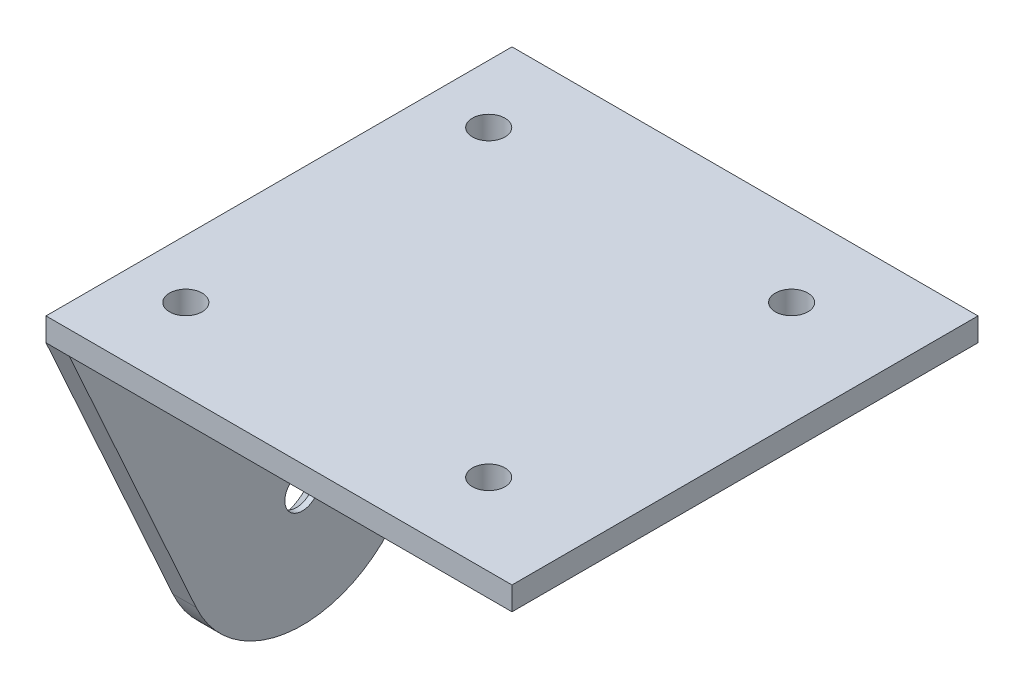
ISO-10303-21;
HEADER;
FILE_DESCRIPTION(('STEP AP214'),'2;1');
FILE_NAME('part.step','',(''),(''),'','','');
FILE_SCHEMA(('AUTOMOTIVE_DESIGN { 1 0 10303 214 1 1 1 1 }'));
ENDSEC;
DATA;
#1=APPLICATION_CONTEXT('core data for automotive mechanical design processes');
#2=APPLICATION_PROTOCOL_DEFINITION('international standard','automotive_design',2000,#1);
#3=PRODUCT_CONTEXT('',#1,'mechanical');
#4=PRODUCT('Part','Part','',(#3));
#5=PRODUCT_RELATED_PRODUCT_CATEGORY('part','',(#4));
#6=PRODUCT_DEFINITION_FORMATION('','',#4);
#7=PRODUCT_DEFINITION_CONTEXT('part definition',#1,'design');
#8=PRODUCT_DEFINITION('design','',#6,#7);
#9=PRODUCT_DEFINITION_SHAPE('','',#8);
#10=(LENGTH_UNIT() NAMED_UNIT(*) SI_UNIT(.MILLI.,.METRE.));
#11=(NAMED_UNIT(*) PLANE_ANGLE_UNIT() SI_UNIT($,.RADIAN.));
#12=(NAMED_UNIT(*) SI_UNIT($,.STERADIAN.) SOLID_ANGLE_UNIT());
#13=UNCERTAINTY_MEASURE_WITH_UNIT(LENGTH_MEASURE(1.E-05),#10,'distance_accuracy_value','');
#14=(GEOMETRIC_REPRESENTATION_CONTEXT(3) GLOBAL_UNCERTAINTY_ASSIGNED_CONTEXT((#13)) GLOBAL_UNIT_ASSIGNED_CONTEXT((#10,
#11,#12)) REPRESENTATION_CONTEXT('',''));
#15=CARTESIAN_POINT('',(0.,0.,0.));
#16=DIRECTION('',(0.,0.,1.));
#17=DIRECTION('',(1.,0.,0.));
#18=AXIS2_PLACEMENT_3D('',#15,#16,#17);
#19=CARTESIAN_POINT('',(0.,0.,0.));
#20=DIRECTION('',(0.,-1.,0.));
#21=DIRECTION('',(0.,0.,-1.));
#22=AXIS2_PLACEMENT_3D('',#19,#20,#21);
#23=PLANE('',#22);
#24=CARTESIAN_POINT('',(-4.55066353464085,0.,9.72300657900497));
#25=DIRECTION('',(0.,1.,0.));
#26=DIRECTION('',(0.,0.,1.));
#27=AXIS2_PLACEMENT_3D('',#24,#25,#26);
#28=CIRCLE('',#27,1.4);
#29=CARTESIAN_POINT('',(-4.55066353464085,0.,11.123006579005));
#30=VERTEX_POINT('',#29);
#31=EDGE_CURVE('E179',#30,#30,#28,.T.);
#32=ORIENTED_EDGE('',*,*,#31,.T.);
#33=EDGE_LOOP('',(#32));
#34=FACE_BOUND('',#33,.T.);
#35=CARTESIAN_POINT('',(21.4493364653592,0.,-16.276993420995));
#36=DIRECTION('',(0.,1.,0.));
#37=DIRECTION('',(0.,0.,1.));
#38=AXIS2_PLACEMENT_3D('',#35,#36,#37);
#39=CIRCLE('',#38,1.4);
#40=CARTESIAN_POINT('',(21.4493364653592,0.,-14.876993420995));
#41=VERTEX_POINT('',#40);
#42=EDGE_CURVE('E190',#41,#41,#39,.T.);
#43=ORIENTED_EDGE('',*,*,#42,.T.);
#44=EDGE_LOOP('',(#43));
#45=FACE_BOUND('',#44,.T.);
#46=CARTESIAN_POINT('',(-4.55066353464085,0.,-16.276993420995));
#47=DIRECTION('',(0.,1.,0.));
#48=DIRECTION('',(0.,0.,1.));
#49=AXIS2_PLACEMENT_3D('',#46,#47,#48);
#50=CIRCLE('',#49,1.4);
#51=CARTESIAN_POINT('',(-4.55066353464085,0.,-14.876993420995));
#52=VERTEX_POINT('',#51);
#53=EDGE_CURVE('E196',#52,#52,#50,.T.);
#54=ORIENTED_EDGE('',*,*,#53,.T.);
#55=EDGE_LOOP('',(#54));
#56=FACE_BOUND('',#55,.T.);
#57=CARTESIAN_POINT('',(21.4493364653592,0.,9.72300657900497));
#58=DIRECTION('',(0.,1.,0.));
#59=DIRECTION('',(0.,0.,1.));
#60=AXIS2_PLACEMENT_3D('',#57,#58,#59);
#61=CIRCLE('',#60,1.4);
#62=CARTESIAN_POINT('',(21.4493364653592,0.,11.123006579005));
#63=VERTEX_POINT('',#62);
#64=EDGE_CURVE('E184',#63,#63,#61,.T.);
#65=ORIENTED_EDGE('',*,*,#64,.T.);
#66=EDGE_LOOP('',(#65));
#67=FACE_BOUND('',#66,.T.);
#68=DIRECTION('',(1.,0.,0.));
#69=VECTOR('',#68,1.);
#70=CARTESIAN_POINT('',(-9.55066353464085,0.,16.723006579005));
#71=LINE('',#70,#69);
#72=CARTESIAN_POINT('',(-7.55066353464085,0.,16.723006579005));
#73=VERTEX_POINT('',#72);
#74=CARTESIAN_POINT('',(30.4493364653592,0.,16.723006579005));
#75=VERTEX_POINT('',#74);
#76=EDGE_CURVE('E74',#73,#75,#71,.T.);
#77=ORIENTED_EDGE('',*,*,#76,.F.);
#78=DIRECTION('',(0.,0.,-1.));
#79=VECTOR('',#78,1.);
#80=CARTESIAN_POINT('',(-7.55066353464085,0.,-23.276993420995));
#81=LINE('',#80,#79);
#82=CARTESIAN_POINT('',(-7.55066353464085,0.,-23.276993420995));
#83=VERTEX_POINT('',#82);
#84=EDGE_CURVE('E120',#73,#83,#81,.T.);
#85=ORIENTED_EDGE('',*,*,#84,.T.);
#86=DIRECTION('',(-1.,0.,0.));
#87=VECTOR('',#86,1.);
#88=CARTESIAN_POINT('',(-9.55066353464085,0.,-23.276993420995));
#89=LINE('',#88,#87);
#90=CARTESIAN_POINT('',(30.4493364653592,0.,-23.276993420995));
#91=VERTEX_POINT('',#90);
#92=EDGE_CURVE('E162',#91,#83,#89,.T.);
#93=ORIENTED_EDGE('',*,*,#92,.F.);
#94=DIRECTION('',(0.,0.,-1.));
#95=VECTOR('',#94,1.);
#96=CARTESIAN_POINT('',(30.4493364653592,0.,16.723006579005));
#97=LINE('',#96,#95);
#98=EDGE_CURVE('E202',#75,#91,#97,.T.);
#99=ORIENTED_EDGE('',*,*,#98,.F.);
#100=EDGE_LOOP('',(#77,#85,#93,#99));
#101=FACE_BOUND('',#100,.T.);
#102=ADVANCED_FACE('F35',(#34,#45,#56,#67,#101),#23,.T.);
#103=CARTESIAN_POINT('',(0.,2.,0.));
#104=DIRECTION('',(0.,-1.,0.));
#105=DIRECTION('',(0.,0.,-1.));
#106=AXIS2_PLACEMENT_3D('',#103,#104,#105);
#107=PLANE('',#106);
#108=CARTESIAN_POINT('',(21.4493364653592,2.,9.72300657900497));
#109=DIRECTION('',(0.,1.,0.));
#110=DIRECTION('',(0.,0.,1.));
#111=AXIS2_PLACEMENT_3D('',#108,#109,#110);
#112=CIRCLE('',#111,1.4);
#113=CARTESIAN_POINT('',(21.4493364653592,2.,11.123006579005));
#114=VERTEX_POINT('',#113);
#115=EDGE_CURVE('E187',#114,#114,#112,.T.);
#116=ORIENTED_EDGE('',*,*,#115,.F.);
#117=EDGE_LOOP('',(#116));
#118=FACE_BOUND('',#117,.T.);
#119=CARTESIAN_POINT('',(-4.55066353464085,2.,-16.276993420995));
#120=DIRECTION('',(0.,1.,0.));
#121=DIRECTION('',(0.,0.,1.));
#122=AXIS2_PLACEMENT_3D('',#119,#120,#121);
#123=CIRCLE('',#122,1.4);
#124=CARTESIAN_POINT('',(-4.55066353464085,2.,-14.876993420995));
#125=VERTEX_POINT('',#124);
#126=EDGE_CURVE('E199',#125,#125,#123,.T.);
#127=ORIENTED_EDGE('',*,*,#126,.F.);
#128=EDGE_LOOP('',(#127));
#129=FACE_BOUND('',#128,.T.);
#130=DIRECTION('',(0.,0.,-1.));
#131=VECTOR('',#130,1.);
#132=CARTESIAN_POINT('',(30.4493364653592,2.,16.723006579005));
#133=LINE('',#132,#131);
#134=CARTESIAN_POINT('',(30.4493364653592,2.,16.723006579005));
#135=VERTEX_POINT('',#134);
#136=CARTESIAN_POINT('',(30.4493364653592,2.,-23.276993420995));
#137=VERTEX_POINT('',#136);
#138=EDGE_CURVE('E205',#135,#137,#133,.T.);
#139=ORIENTED_EDGE('',*,*,#138,.T.);
#140=DIRECTION('',(-1.,0.,0.));
#141=VECTOR('',#140,1.);
#142=CARTESIAN_POINT('',(-9.55066353464085,2.,-23.276993420995));
#143=LINE('',#142,#141);
#144=CARTESIAN_POINT('',(-9.55066353464085,2.,-23.276993420995));
#145=VERTEX_POINT('',#144);
#146=EDGE_CURVE('E82',#137,#145,#143,.T.);
#147=ORIENTED_EDGE('',*,*,#146,.T.);
#148=DIRECTION('',(0.,0.,1.));
#149=VECTOR('',#148,1.);
#150=CARTESIAN_POINT('',(-9.55066353464085,2.,16.723006579005));
#151=LINE('',#150,#149);
#152=CARTESIAN_POINT('',(-9.55066353464085,2.,16.723006579005));
#153=VERTEX_POINT('',#152);
#154=EDGE_CURVE('E177',#145,#153,#151,.T.);
#155=ORIENTED_EDGE('',*,*,#154,.T.);
#156=DIRECTION('',(1.,0.,0.));
#157=VECTOR('',#156,1.);
#158=CARTESIAN_POINT('',(-9.55066353464085,2.,16.723006579005));
#159=LINE('',#158,#157);
#160=EDGE_CURVE('E59',#153,#135,#159,.T.);
#161=ORIENTED_EDGE('',*,*,#160,.T.);
#162=EDGE_LOOP('',(#139,#147,#155,#161));
#163=FACE_BOUND('',#162,.T.);
#164=CARTESIAN_POINT('',(21.4493364653592,2.,-16.276993420995));
#165=DIRECTION('',(0.,1.,0.));
#166=DIRECTION('',(0.,0.,1.));
#167=AXIS2_PLACEMENT_3D('',#164,#165,#166);
#168=CIRCLE('',#167,1.4);
#169=CARTESIAN_POINT('',(21.4493364653592,2.,-14.876993420995));
#170=VERTEX_POINT('',#169);
#171=EDGE_CURVE('E193',#170,#170,#168,.T.);
#172=ORIENTED_EDGE('',*,*,#171,.F.);
#173=EDGE_LOOP('',(#172));
#174=FACE_BOUND('',#173,.T.);
#175=CARTESIAN_POINT('',(-4.55066353464085,2.,9.72300657900497));
#176=DIRECTION('',(0.,1.,0.));
#177=DIRECTION('',(0.,0.,1.));
#178=AXIS2_PLACEMENT_3D('',#175,#176,#177);
#179=CIRCLE('',#178,1.4);
#180=CARTESIAN_POINT('',(-4.55066353464085,2.,11.123006579005));
#181=VERTEX_POINT('',#180);
#182=EDGE_CURVE('E181',#181,#181,#179,.T.);
#183=ORIENTED_EDGE('',*,*,#182,.F.);
#184=EDGE_LOOP('',(#183));
#185=FACE_BOUND('',#184,.T.);
#186=ADVANCED_FACE('F215',(#118,#129,#163,#174,#185),#107,.F.);
#187=CARTESIAN_POINT('',(30.4493364653592,2.,16.723006579005));
#188=DIRECTION('',(-1.,0.,0.));
#189=DIRECTION('',(0.,0.,1.));
#190=AXIS2_PLACEMENT_3D('',#187,#188,#189);
#191=PLANE('',#190);
#192=ORIENTED_EDGE('',*,*,#98,.T.);
#193=DIRECTION('',(0.,-1.,0.));
#194=VECTOR('',#193,1.);
#195=CARTESIAN_POINT('',(30.4493364653592,2.,-23.276993420995));
#196=LINE('',#195,#194);
#197=EDGE_CURVE('E146',#137,#91,#196,.T.);
#198=ORIENTED_EDGE('',*,*,#197,.F.);
#199=ORIENTED_EDGE('',*,*,#138,.F.);
#200=DIRECTION('',(0.,-1.,0.));
#201=VECTOR('',#200,1.);
#202=CARTESIAN_POINT('',(30.4493364653592,2.,16.723006579005));
#203=LINE('',#202,#201);
#204=EDGE_CURVE('E169',#135,#75,#203,.T.);
#205=ORIENTED_EDGE('',*,*,#204,.T.);
#206=EDGE_LOOP('',(#192,#198,#199,#205));
#207=FACE_BOUND('',#206,.T.);
#208=ADVANCED_FACE('F221',(#207),#191,.F.);
#209=CARTESIAN_POINT('',(-9.55066353464085,2.,-23.276993420995));
#210=DIRECTION('',(0.,0.,1.));
#211=DIRECTION('',(1.,0.,0.));
#212=AXIS2_PLACEMENT_3D('',#209,#210,#211);
#213=PLANE('',#212);
#214=ORIENTED_EDGE('',*,*,#92,.T.);
#215=DIRECTION('',(-1.,0.,0.));
#216=VECTOR('',#215,1.);
#217=CARTESIAN_POINT('',(-7.55066353464085,0.,-23.276993420995));
#218=LINE('',#217,#216);
#219=CARTESIAN_POINT('',(-9.55066353464085,0.,-23.276993420995));
#220=VERTEX_POINT('',#219);
#221=EDGE_CURVE('E115',#83,#220,#218,.T.);
#222=ORIENTED_EDGE('',*,*,#221,.T.);
#223=DIRECTION('',(0.,-1.,0.));
#224=VECTOR('',#223,1.);
#225=CARTESIAN_POINT('',(-9.55066353464085,2.,-23.276993420995));
#226=LINE('',#225,#224);
#227=EDGE_CURVE('E149',#145,#220,#226,.T.);
#228=ORIENTED_EDGE('',*,*,#227,.F.);
#229=ORIENTED_EDGE('',*,*,#146,.F.);
#230=ORIENTED_EDGE('',*,*,#197,.T.);
#231=EDGE_LOOP('',(#214,#222,#228,#229,#230));
#232=FACE_BOUND('',#231,.T.);
#233=ADVANCED_FACE('F232',(#232),#213,.F.);
#234=CARTESIAN_POINT('',(-9.55066353464085,2.,16.723006579005));
#235=DIRECTION('',(1.,0.,0.));
#236=DIRECTION('',(0.,0.,-1.));
#237=AXIS2_PLACEMENT_3D('',#234,#235,#236);
#238=PLANE('',#237);
#239=CARTESIAN_POINT('',(-9.55066353464085,-20.,-3.27699342099503));
#240=DIRECTION('',(1.,0.,0.));
#241=DIRECTION('',(0.,0.,-1.));
#242=AXIS2_PLACEMENT_3D('',#239,#240,#241);
#243=CIRCLE('',#242,3.);
#244=CARTESIAN_POINT('',(-9.55066353464085,-20.,-6.27699342099504));
#245=VERTEX_POINT('',#244);
#246=EDGE_CURVE('E11',#245,#245,#243,.T.);
#247=ORIENTED_EDGE('',*,*,#246,.T.);
#248=EDGE_LOOP('',(#247));
#249=FACE_BOUND('',#248,.T.);
#250=ORIENTED_EDGE('',*,*,#227,.T.);
#251=DIRECTION('',(0.,-0.911437827766148,0.411437827766148));
#252=VECTOR('',#251,1.);
#253=CARTESIAN_POINT('',(-9.55066353464085,-24.1143782776615,-12.3913716986565));
#254=LINE('',#253,#252);
#255=CARTESIAN_POINT('',(-9.55066353464085,-24.1143782776615,-12.3913716986565));
#256=VERTEX_POINT('',#255);
#257=EDGE_CURVE('E124',#220,#256,#254,.T.);
#258=ORIENTED_EDGE('',*,*,#257,.T.);
#259=CARTESIAN_POINT('',(-9.55066353464085,-20.,-3.27699342099503));
#260=DIRECTION('',(-1.,0.,0.));
#261=DIRECTION('',(0.,0.,1.));
#262=AXIS2_PLACEMENT_3D('',#259,#260,#261);
#263=CIRCLE('',#262,10.);
#264=CARTESIAN_POINT('',(-9.55066353464085,-24.1143782776615,5.83738485666645));
#265=VERTEX_POINT('',#264);
#266=EDGE_CURVE('E133',#256,#265,#263,.T.);
#267=ORIENTED_EDGE('',*,*,#266,.T.);
#268=DIRECTION('',(0.,0.911437827766148,0.411437827766147));
#269=VECTOR('',#268,1.);
#270=CARTESIAN_POINT('',(-9.55066353464085,0.,16.723006579005));
#271=LINE('',#270,#269);
#272=CARTESIAN_POINT('',(-9.55066353464085,0.,16.723006579005));
#273=VERTEX_POINT('',#272);
#274=EDGE_CURVE('E110',#265,#273,#271,.T.);
#275=ORIENTED_EDGE('',*,*,#274,.T.);
#276=DIRECTION('',(0.,-1.,0.));
#277=VECTOR('',#276,1.);
#278=CARTESIAN_POINT('',(-9.55066353464085,2.,16.723006579005));
#279=LINE('',#278,#277);
#280=EDGE_CURVE('E155',#153,#273,#279,.T.);
#281=ORIENTED_EDGE('',*,*,#280,.F.);
#282=ORIENTED_EDGE('',*,*,#154,.F.);
#283=EDGE_LOOP('',(#250,#258,#267,#275,#281,#282));
#284=FACE_BOUND('',#283,.T.);
#285=ADVANCED_FACE('F176',(#249,#284),#238,.F.);
#286=CARTESIAN_POINT('',(-9.55066353464085,2.,16.723006579005));
#287=DIRECTION('',(0.,0.,-1.));
#288=DIRECTION('',(-1.,0.,0.));
#289=AXIS2_PLACEMENT_3D('',#286,#287,#288);
#290=PLANE('',#289);
#291=EDGE_CURVE('E161',#273,#73,#71,.T.);
#292=ORIENTED_EDGE('',*,*,#291,.T.);
#293=ORIENTED_EDGE('',*,*,#76,.T.);
#294=ORIENTED_EDGE('',*,*,#204,.F.);
#295=ORIENTED_EDGE('',*,*,#160,.F.);
#296=ORIENTED_EDGE('',*,*,#280,.T.);
#297=EDGE_LOOP('',(#292,#293,#294,#295,#296));
#298=FACE_BOUND('',#297,.T.);
#299=ADVANCED_FACE('F173',(#298),#290,.F.);
#300=CARTESIAN_POINT('',(-4.55066353464085,2.,-16.276993420995));
#301=DIRECTION('',(0.,-1.,0.));
#302=DIRECTION('',(0.,0.,-1.));
#303=AXIS2_PLACEMENT_3D('',#300,#301,#302);
#304=CYLINDRICAL_SURFACE('',#303,1.4);
#305=ORIENTED_EDGE('',*,*,#126,.T.);
#306=EDGE_LOOP('',(#305));
#307=FACE_BOUND('',#306,.T.);
#308=ORIENTED_EDGE('',*,*,#53,.F.);
#309=EDGE_LOOP('',(#308));
#310=FACE_BOUND('',#309,.T.);
#311=ADVANCED_FACE('F229',(#307,#310),#304,.F.);
#312=CARTESIAN_POINT('',(21.4493364653592,2.,-16.276993420995));
#313=DIRECTION('',(0.,-1.,0.));
#314=DIRECTION('',(0.,0.,-1.));
#315=AXIS2_PLACEMENT_3D('',#312,#313,#314);
#316=CYLINDRICAL_SURFACE('',#315,1.4);
#317=ORIENTED_EDGE('',*,*,#171,.T.);
#318=EDGE_LOOP('',(#317));
#319=FACE_BOUND('',#318,.T.);
#320=ORIENTED_EDGE('',*,*,#42,.F.);
#321=EDGE_LOOP('',(#320));
#322=FACE_BOUND('',#321,.T.);
#323=ADVANCED_FACE('F261',(#319,#322),#316,.F.);
#324=CARTESIAN_POINT('',(21.4493364653592,2.,9.72300657900497));
#325=DIRECTION('',(0.,-1.,0.));
#326=DIRECTION('',(0.,0.,-1.));
#327=AXIS2_PLACEMENT_3D('',#324,#325,#326);
#328=CYLINDRICAL_SURFACE('',#327,1.4);
#329=ORIENTED_EDGE('',*,*,#115,.T.);
#330=EDGE_LOOP('',(#329));
#331=FACE_BOUND('',#330,.T.);
#332=ORIENTED_EDGE('',*,*,#64,.F.);
#333=EDGE_LOOP('',(#332));
#334=FACE_BOUND('',#333,.T.);
#335=ADVANCED_FACE('F268',(#331,#334),#328,.F.);
#336=CARTESIAN_POINT('',(-4.55066353464085,2.,9.72300657900497));
#337=DIRECTION('',(0.,-1.,0.));
#338=DIRECTION('',(0.,0.,-1.));
#339=AXIS2_PLACEMENT_3D('',#336,#337,#338);
#340=CYLINDRICAL_SURFACE('',#339,1.4);
#341=ORIENTED_EDGE('',*,*,#182,.T.);
#342=EDGE_LOOP('',(#341));
#343=FACE_BOUND('',#342,.T.);
#344=ORIENTED_EDGE('',*,*,#31,.F.);
#345=EDGE_LOOP('',(#344));
#346=FACE_BOUND('',#345,.T.);
#347=ADVANCED_FACE('F276',(#343,#346),#340,.F.);
#348=CARTESIAN_POINT('',(-7.55066353464085,-20.,-3.27699342099503));
#349=DIRECTION('',(-1.,0.,0.));
#350=DIRECTION('',(0.,0.,1.));
#351=AXIS2_PLACEMENT_3D('',#348,#349,#350);
#352=CYLINDRICAL_SURFACE('',#351,10.);
#353=ORIENTED_EDGE('',*,*,#266,.F.);
#354=DIRECTION('',(-1.,0.,0.));
#355=VECTOR('',#354,1.);
#356=CARTESIAN_POINT('',(-7.55066353464085,-24.1143782776615,-12.3913716986565));
#357=LINE('',#356,#355);
#358=CARTESIAN_POINT('',(-7.55066353464085,-24.1143782776615,-12.3913716986565));
#359=VERTEX_POINT('',#358);
#360=EDGE_CURVE('E123',#359,#256,#357,.T.);
#361=ORIENTED_EDGE('',*,*,#360,.F.);
#362=CARTESIAN_POINT('',(-7.55066353464085,-20.,-3.27699342099503));
#363=DIRECTION('',(-1.,0.,0.));
#364=DIRECTION('',(0.,0.,1.));
#365=AXIS2_PLACEMENT_3D('',#362,#363,#364);
#366=CIRCLE('',#365,10.);
#367=CARTESIAN_POINT('',(-7.55066353464085,-24.1143782776615,5.83738485666645));
#368=VERTEX_POINT('',#367);
#369=EDGE_CURVE('E118',#359,#368,#366,.T.);
#370=ORIENTED_EDGE('',*,*,#369,.T.);
#371=DIRECTION('',(-1.,0.,0.));
#372=VECTOR('',#371,1.);
#373=CARTESIAN_POINT('',(-7.55066353464085,-24.1143782776615,5.83738485666645));
#374=LINE('',#373,#372);
#375=EDGE_CURVE('E105',#368,#265,#374,.T.);
#376=ORIENTED_EDGE('',*,*,#375,.T.);
#377=EDGE_LOOP('',(#353,#361,#370,#376));
#378=FACE_BOUND('',#377,.T.);
#379=ADVANCED_FACE('F122',(#378),#352,.T.);
#380=CARTESIAN_POINT('',(-7.55066353464085,-24.1143782776615,-12.3913716986565));
#381=DIRECTION('',(0.,-0.411437827766148,-0.911437827766148));
#382=DIRECTION('',(0.,0.911437827766148,-0.411437827766148));
#383=AXIS2_PLACEMENT_3D('',#380,#381,#382);
#384=PLANE('',#383);
#385=ORIENTED_EDGE('',*,*,#257,.F.);
#386=ORIENTED_EDGE('',*,*,#221,.F.);
#387=DIRECTION('',(0.,-0.911437827766148,0.411437827766148));
#388=VECTOR('',#387,1.);
#389=CARTESIAN_POINT('',(-7.55066353464085,-24.1143782776615,-12.3913716986565));
#390=LINE('',#389,#388);
#391=EDGE_CURVE('E50',#83,#359,#390,.T.);
#392=ORIENTED_EDGE('',*,*,#391,.T.);
#393=ORIENTED_EDGE('',*,*,#360,.T.);
#394=EDGE_LOOP('',(#385,#386,#392,#393));
#395=FACE_BOUND('',#394,.T.);
#396=ADVANCED_FACE('F212',(#395),#384,.T.);
#397=CARTESIAN_POINT('',(-7.55066353464085,0.,16.723006579005));
#398=DIRECTION('',(0.,-0.411437827766148,0.911437827766148));
#399=DIRECTION('',(0.,-0.911437827766148,-0.411437827766148));
#400=AXIS2_PLACEMENT_3D('',#397,#398,#399);
#401=PLANE('',#400);
#402=ORIENTED_EDGE('',*,*,#274,.F.);
#403=ORIENTED_EDGE('',*,*,#375,.F.);
#404=DIRECTION('',(0.,0.911437827766148,0.411437827766147));
#405=VECTOR('',#404,1.);
#406=CARTESIAN_POINT('',(-7.55066353464085,0.,16.723006579005));
#407=LINE('',#406,#405);
#408=EDGE_CURVE('E108',#368,#73,#407,.T.);
#409=ORIENTED_EDGE('',*,*,#408,.T.);
#410=ORIENTED_EDGE('',*,*,#291,.F.);
#411=EDGE_LOOP('',(#402,#403,#409,#410));
#412=FACE_BOUND('',#411,.T.);
#413=ADVANCED_FACE('F107',(#412),#401,.T.);
#414=CARTESIAN_POINT('',(-7.55066353464085,-20.,-3.27699342099503));
#415=DIRECTION('',(-1.,0.,0.));
#416=DIRECTION('',(0.,0.,1.));
#417=AXIS2_PLACEMENT_3D('',#414,#415,#416);
#418=PLANE('',#417);
#419=CARTESIAN_POINT('',(-7.55066353464085,-20.,-3.27699342099503));
#420=DIRECTION('',(-1.,0.,0.));
#421=DIRECTION('',(0.,0.,1.));
#422=AXIS2_PLACEMENT_3D('',#419,#420,#421);
#423=CIRCLE('',#422,1.5);
#424=CARTESIAN_POINT('',(-7.55066353464085,-20.,-1.77699342099503));
#425=VERTEX_POINT('',#424);
#426=EDGE_CURVE('E130',#425,#425,#423,.T.);
#427=ORIENTED_EDGE('',*,*,#426,.T.);
#428=EDGE_LOOP('',(#427));
#429=FACE_BOUND('',#428,.T.);
#430=ORIENTED_EDGE('',*,*,#369,.F.);
#431=ORIENTED_EDGE('',*,*,#391,.F.);
#432=ORIENTED_EDGE('',*,*,#84,.F.);
#433=ORIENTED_EDGE('',*,*,#408,.F.);
#434=EDGE_LOOP('',(#430,#431,#432,#433));
#435=FACE_BOUND('',#434,.T.);
#436=ADVANCED_FACE('F117',(#429,#435),#418,.F.);
#437=CARTESIAN_POINT('',(-7.55066353464085,-20.,-3.27699342099503));
#438=DIRECTION('',(-1.,0.,0.));
#439=DIRECTION('',(0.,0.,1.));
#440=AXIS2_PLACEMENT_3D('',#437,#438,#439);
#441=CYLINDRICAL_SURFACE('',#440,1.5);
#442=CARTESIAN_POINT('',(-8.05066353464085,-20.,-3.27699342099503));
#443=DIRECTION('',(1.,0.,0.));
#444=DIRECTION('',(0.,0.,-1.));
#445=AXIS2_PLACEMENT_3D('',#442,#443,#444);
#446=CIRCLE('',#445,1.5);
#447=CARTESIAN_POINT('',(-8.05066353464085,-20.,-4.77699342099504));
#448=VERTEX_POINT('',#447);
#449=EDGE_CURVE('E43',#448,#448,#446,.F.);
#450=ORIENTED_EDGE('',*,*,#449,.T.);
#451=EDGE_LOOP('',(#450));
#452=FACE_BOUND('',#451,.T.);
#453=ORIENTED_EDGE('',*,*,#426,.F.);
#454=EDGE_LOOP('',(#453));
#455=FACE_BOUND('',#454,.T.);
#456=ADVANCED_FACE('F307',(#452,#455),#441,.F.);
#457=CARTESIAN_POINT('',(-8.05066353464085,-20.,-3.27699342099503));
#458=DIRECTION('',(-1.,0.,0.));
#459=DIRECTION('',(0.,0.,1.));
#460=AXIS2_PLACEMENT_3D('',#457,#458,#459);
#461=CONICAL_SURFACE('',#460,1.5,0.785398163397449);
#462=ORIENTED_EDGE('',*,*,#246,.F.);
#463=EDGE_LOOP('',(#462));
#464=FACE_BOUND('',#463,.T.);
#465=ORIENTED_EDGE('',*,*,#449,.F.);
#466=EDGE_LOOP('',(#465));
#467=FACE_BOUND('',#466,.T.);
#468=ADVANCED_FACE('F37',(#464,#467),#461,.F.);
#469=CLOSED_SHELL('',(#102,#186,#208,#233,#285,#299,#311,#323,#335,#347,#379,#396,#413,#436,
#456,#468));
#470=MANIFOLD_SOLID_BREP('B2',#469);
#471=ADVANCED_BREP_SHAPE_REPRESENTATION('',(#18,#470),#14);
#472=SHAPE_DEFINITION_REPRESENTATION(#9,#471);
ENDSEC;
END-ISO-10303-21;
